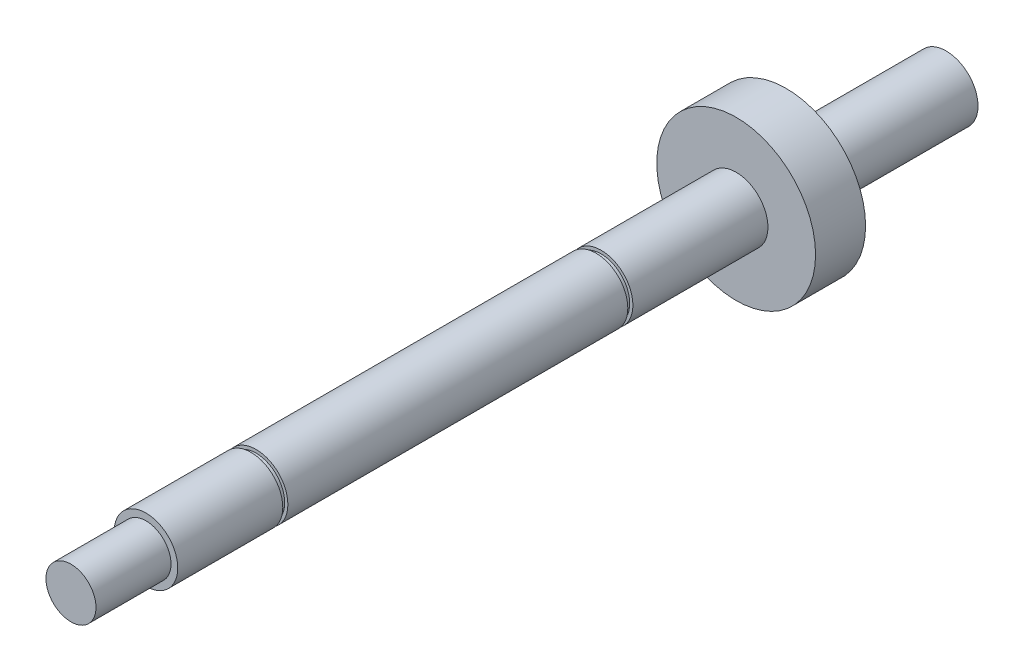
ISO-10303-21;
HEADER;
FILE_DESCRIPTION(('STEP AP214'),'2;1');
FILE_NAME('part.step','',(''),(''),'','','');
FILE_SCHEMA(('AUTOMOTIVE_DESIGN { 1 0 10303 214 1 1 1 1 }'));
ENDSEC;
DATA;
#1=APPLICATION_CONTEXT('core data for automotive mechanical design processes');
#2=APPLICATION_PROTOCOL_DEFINITION('international standard','automotive_design',2000,#1);
#3=PRODUCT_CONTEXT('',#1,'mechanical');
#4=PRODUCT('Part','Part','',(#3));
#5=PRODUCT_RELATED_PRODUCT_CATEGORY('part','',(#4));
#6=PRODUCT_DEFINITION_FORMATION('','',#4);
#7=PRODUCT_DEFINITION_CONTEXT('part definition',#1,'design');
#8=PRODUCT_DEFINITION('design','',#6,#7);
#9=PRODUCT_DEFINITION_SHAPE('','',#8);
#10=(LENGTH_UNIT() NAMED_UNIT(*) SI_UNIT(.MILLI.,.METRE.));
#11=(NAMED_UNIT(*) PLANE_ANGLE_UNIT() SI_UNIT($,.RADIAN.));
#12=(NAMED_UNIT(*) SI_UNIT($,.STERADIAN.) SOLID_ANGLE_UNIT());
#13=UNCERTAINTY_MEASURE_WITH_UNIT(LENGTH_MEASURE(1.E-05),#10,'distance_accuracy_value','');
#14=(GEOMETRIC_REPRESENTATION_CONTEXT(3) GLOBAL_UNCERTAINTY_ASSIGNED_CONTEXT((#13)) GLOBAL_UNIT_ASSIGNED_CONTEXT((#10,
#11,#12)) REPRESENTATION_CONTEXT('',''));
#15=CARTESIAN_POINT('',(0.,0.,0.));
#16=DIRECTION('',(0.,0.,1.));
#17=DIRECTION('',(1.,0.,0.));
#18=AXIS2_PLACEMENT_3D('',#15,#16,#17);
#19=CARTESIAN_POINT('',(0.,0.,175.));
#20=DIRECTION('',(0.,0.,-1.));
#21=DIRECTION('',(-1.,0.,0.));
#22=AXIS2_PLACEMENT_3D('',#19,#20,#21);
#23=CYLINDRICAL_SURFACE('',#22,6.35);
#24=CARTESIAN_POINT('',(0.,0.,70.016));
#25=DIRECTION('',(0.,0.,1.));
#26=DIRECTION('',(1.,0.,0.));
#27=AXIS2_PLACEMENT_3D('',#24,#25,#26);
#28=CIRCLE('',#27,6.35);
#29=CARTESIAN_POINT('',(6.35,0.,70.016));
#30=VERTEX_POINT('',#29);
#31=EDGE_CURVE('E53',#30,#30,#28,.T.);
#32=ORIENTED_EDGE('',*,*,#31,.T.);
#33=EDGE_LOOP('',(#32));
#34=FACE_BOUND('',#33,.T.);
#35=CARTESIAN_POINT('',(0.,0.,137.984));
#36=DIRECTION('',(0.,0.,1.));
#37=DIRECTION('',(1.,0.,0.));
#38=AXIS2_PLACEMENT_3D('',#35,#36,#37);
#39=CIRCLE('',#38,6.35);
#40=CARTESIAN_POINT('',(6.35,0.,137.984));
#41=VERTEX_POINT('',#40);
#42=EDGE_CURVE('E35',#41,#41,#39,.T.);
#43=ORIENTED_EDGE('',*,*,#42,.F.);
#44=EDGE_LOOP('',(#43));
#45=FACE_BOUND('',#44,.T.);
#46=ADVANCED_FACE('F31',(#34,#45),#23,.T.);
#47=CARTESIAN_POINT('',(0.,0.,42.));
#48=DIRECTION('',(0.,0.,1.));
#49=DIRECTION('',(1.,0.,0.));
#50=AXIS2_PLACEMENT_3D('',#47,#48,#49);
#51=CIRCLE('',#50,6.35);
#52=CARTESIAN_POINT('',(6.35,0.,42.));
#53=VERTEX_POINT('',#52);
#54=EDGE_CURVE('E48',#53,#53,#51,.T.);
#55=ORIENTED_EDGE('',*,*,#54,.T.);
#56=EDGE_LOOP('',(#55));
#57=FACE_BOUND('',#56,.T.);
#58=CARTESIAN_POINT('',(0.,0.,69.));
#59=DIRECTION('',(0.,0.,1.));
#60=DIRECTION('',(1.,0.,0.));
#61=AXIS2_PLACEMENT_3D('',#58,#59,#60);
#62=CIRCLE('',#61,6.35);
#63=CARTESIAN_POINT('',(6.35,0.,69.));
#64=VERTEX_POINT('',#63);
#65=EDGE_CURVE('E50',#64,#64,#62,.T.);
#66=ORIENTED_EDGE('',*,*,#65,.F.);
#67=EDGE_LOOP('',(#66));
#68=FACE_BOUND('',#67,.T.);
#69=ADVANCED_FACE('F100',(#57,#68),#23,.T.);
#70=CARTESIAN_POINT('',(0.,0.,32.));
#71=DIRECTION('',(0.,0.,1.));
#72=DIRECTION('',(1.,0.,0.));
#73=AXIS2_PLACEMENT_3D('',#70,#71,#72);
#74=CYLINDRICAL_SURFACE('',#73,15.875);
#75=CARTESIAN_POINT('',(0.,0.,32.));
#76=DIRECTION('',(0.,0.,1.));
#77=DIRECTION('',(1.,0.,0.));
#78=AXIS2_PLACEMENT_3D('',#75,#76,#77);
#79=CIRCLE('',#78,15.875);
#80=CARTESIAN_POINT('',(15.875,0.,32.));
#81=VERTEX_POINT('',#80);
#82=EDGE_CURVE('E76',#81,#81,#79,.T.);
#83=ORIENTED_EDGE('',*,*,#82,.T.);
#84=EDGE_LOOP('',(#83));
#85=FACE_BOUND('',#84,.T.);
#86=CARTESIAN_POINT('',(0.,0.,42.));
#87=DIRECTION('',(0.,0.,1.));
#88=DIRECTION('',(1.,0.,0.));
#89=AXIS2_PLACEMENT_3D('',#86,#87,#88);
#90=CIRCLE('',#89,15.875);
#91=CARTESIAN_POINT('',(15.875,0.,42.));
#92=VERTEX_POINT('',#91);
#93=EDGE_CURVE('E56',#92,#92,#90,.T.);
#94=ORIENTED_EDGE('',*,*,#93,.F.);
#95=EDGE_LOOP('',(#94));
#96=FACE_BOUND('',#95,.T.);
#97=ADVANCED_FACE('F117',(#85,#96),#74,.T.);
#98=CARTESIAN_POINT('',(0.,0.,32.));
#99=DIRECTION('',(0.,0.,1.));
#100=DIRECTION('',(1.,0.,0.));
#101=AXIS2_PLACEMENT_3D('',#98,#99,#100);
#102=PLANE('',#101);
#103=CARTESIAN_POINT('',(0.,0.,32.));
#104=DIRECTION('',(0.,0.,1.));
#105=DIRECTION('',(1.,0.,0.));
#106=AXIS2_PLACEMENT_3D('',#103,#104,#105);
#107=CIRCLE('',#106,6.35);
#108=CARTESIAN_POINT('',(6.35,0.,32.));
#109=VERTEX_POINT('',#108);
#110=EDGE_CURVE('E10',#109,#109,#107,.T.);
#111=ORIENTED_EDGE('',*,*,#110,.T.);
#112=EDGE_LOOP('',(#111));
#113=FACE_BOUND('',#112,.T.);
#114=ORIENTED_EDGE('',*,*,#82,.F.);
#115=EDGE_LOOP('',(#114));
#116=FACE_BOUND('',#115,.T.);
#117=ADVANCED_FACE('F122',(#113,#116),#102,.F.);
#118=CARTESIAN_POINT('',(0.,0.,42.));
#119=DIRECTION('',(0.,0.,1.));
#120=DIRECTION('',(1.,0.,0.));
#121=AXIS2_PLACEMENT_3D('',#118,#119,#120);
#122=PLANE('',#121);
#123=ORIENTED_EDGE('',*,*,#54,.F.);
#124=EDGE_LOOP('',(#123));
#125=FACE_BOUND('',#124,.T.);
#126=ORIENTED_EDGE('',*,*,#93,.T.);
#127=EDGE_LOOP('',(#126));
#128=FACE_BOUND('',#127,.T.);
#129=ADVANCED_FACE('F113',(#125,#128),#122,.T.);
#130=CARTESIAN_POINT('',(0.,0.,0.));
#131=DIRECTION('',(0.,0.,1.));
#132=DIRECTION('',(1.,0.,0.));
#133=AXIS2_PLACEMENT_3D('',#130,#131,#132);
#134=PLANE('',#133);
#135=CARTESIAN_POINT('',(0.,0.,0.));
#136=DIRECTION('',(0.,0.,1.));
#137=DIRECTION('',(1.,0.,0.));
#138=AXIS2_PLACEMENT_3D('',#135,#136,#137);
#139=CIRCLE('',#138,6.35);
#140=CARTESIAN_POINT('',(6.35,0.,0.));
#141=VERTEX_POINT('',#140);
#142=EDGE_CURVE('E39',#141,#141,#139,.T.);
#143=ORIENTED_EDGE('',*,*,#142,.F.);
#144=EDGE_LOOP('',(#143));
#145=FACE_BOUND('',#144,.T.);
#146=ADVANCED_FACE('F104',(#145),#134,.F.);
#147=ORIENTED_EDGE('',*,*,#142,.T.);
#148=EDGE_LOOP('',(#147));
#149=FACE_BOUND('',#148,.T.);
#150=ORIENTED_EDGE('',*,*,#110,.F.);
#151=EDGE_LOOP('',(#150));
#152=FACE_BOUND('',#151,.T.);
#153=ADVANCED_FACE('F92',(#149,#152),#23,.T.);
#154=CARTESIAN_POINT('',(0.,0.,70.016));
#155=DIRECTION('',(0.,0.,1.));
#156=DIRECTION('',(1.,0.,0.));
#157=AXIS2_PLACEMENT_3D('',#154,#155,#156);
#158=PLANE('',#157);
#159=CARTESIAN_POINT('',(0.,0.,70.016));
#160=DIRECTION('',(0.,0.,1.));
#161=DIRECTION('',(1.,0.,0.));
#162=AXIS2_PLACEMENT_3D('',#159,#160,#161);
#163=CIRCLE('',#162,5.715);
#164=CARTESIAN_POINT('',(5.715,0.,70.016));
#165=VERTEX_POINT('',#164);
#166=EDGE_CURVE('E54',#165,#165,#163,.T.);
#167=ORIENTED_EDGE('',*,*,#166,.T.);
#168=EDGE_LOOP('',(#167));
#169=FACE_BOUND('',#168,.T.);
#170=ORIENTED_EDGE('',*,*,#31,.F.);
#171=EDGE_LOOP('',(#170));
#172=FACE_BOUND('',#171,.T.);
#173=ADVANCED_FACE('F103',(#169,#172),#158,.F.);
#174=CARTESIAN_POINT('',(0.,0.,69.));
#175=DIRECTION('',(0.,0.,1.));
#176=DIRECTION('',(1.,0.,0.));
#177=AXIS2_PLACEMENT_3D('',#174,#175,#176);
#178=PLANE('',#177);
#179=CARTESIAN_POINT('',(0.,0.,69.));
#180=DIRECTION('',(0.,0.,1.));
#181=DIRECTION('',(1.,0.,0.));
#182=AXIS2_PLACEMENT_3D('',#179,#180,#181);
#183=CIRCLE('',#182,5.715);
#184=CARTESIAN_POINT('',(5.715,0.,69.));
#185=VERTEX_POINT('',#184);
#186=EDGE_CURVE('E63',#185,#185,#183,.T.);
#187=ORIENTED_EDGE('',*,*,#186,.F.);
#188=EDGE_LOOP('',(#187));
#189=FACE_BOUND('',#188,.T.);
#190=ORIENTED_EDGE('',*,*,#65,.T.);
#191=EDGE_LOOP('',(#190));
#192=FACE_BOUND('',#191,.T.);
#193=ADVANCED_FACE('F110',(#189,#192),#178,.T.);
#194=CARTESIAN_POINT('',(0.,0.,70.016));
#195=DIRECTION('',(0.,0.,-1.));
#196=DIRECTION('',(-1.,0.,0.));
#197=AXIS2_PLACEMENT_3D('',#194,#195,#196);
#198=CYLINDRICAL_SURFACE('',#197,5.715);
#199=ORIENTED_EDGE('',*,*,#166,.F.);
#200=EDGE_LOOP('',(#199));
#201=FACE_BOUND('',#200,.T.);
#202=ORIENTED_EDGE('',*,*,#186,.T.);
#203=EDGE_LOOP('',(#202));
#204=FACE_BOUND('',#203,.T.);
#205=ADVANCED_FACE('F131',(#201,#204),#198,.T.);
#206=CARTESIAN_POINT('',(0.,0.,137.984));
#207=DIRECTION('',(0.,0.,1.));
#208=DIRECTION('',(1.,0.,0.));
#209=AXIS2_PLACEMENT_3D('',#206,#207,#208);
#210=PLANE('',#209);
#211=CARTESIAN_POINT('',(0.,0.,137.984));
#212=DIRECTION('',(0.,0.,1.));
#213=DIRECTION('',(1.,0.,0.));
#214=AXIS2_PLACEMENT_3D('',#211,#212,#213);
#215=CIRCLE('',#214,5.715);
#216=CARTESIAN_POINT('',(5.715,0.,137.984));
#217=VERTEX_POINT('',#216);
#218=EDGE_CURVE('E59',#217,#217,#215,.T.);
#219=ORIENTED_EDGE('',*,*,#218,.F.);
#220=EDGE_LOOP('',(#219));
#221=FACE_BOUND('',#220,.T.);
#222=ORIENTED_EDGE('',*,*,#42,.T.);
#223=EDGE_LOOP('',(#222));
#224=FACE_BOUND('',#223,.T.);
#225=ADVANCED_FACE('F137',(#221,#224),#210,.T.);
#226=CARTESIAN_POINT('',(0.,0.,139.));
#227=DIRECTION('',(0.,0.,1.));
#228=DIRECTION('',(1.,0.,0.));
#229=AXIS2_PLACEMENT_3D('',#226,#227,#228);
#230=PLANE('',#229);
#231=CARTESIAN_POINT('',(0.,0.,139.));
#232=DIRECTION('',(0.,0.,1.));
#233=DIRECTION('',(1.,0.,0.));
#234=AXIS2_PLACEMENT_3D('',#231,#232,#233);
#235=CIRCLE('',#234,5.715);
#236=CARTESIAN_POINT('',(5.715,0.,139.));
#237=VERTEX_POINT('',#236);
#238=EDGE_CURVE('E65',#237,#237,#235,.T.);
#239=ORIENTED_EDGE('',*,*,#238,.T.);
#240=EDGE_LOOP('',(#239));
#241=FACE_BOUND('',#240,.T.);
#242=CARTESIAN_POINT('',(0.,0.,139.));
#243=DIRECTION('',(0.,0.,1.));
#244=DIRECTION('',(1.,0.,0.));
#245=AXIS2_PLACEMENT_3D('',#242,#243,#244);
#246=CIRCLE('',#245,6.35);
#247=CARTESIAN_POINT('',(6.35,0.,139.));
#248=VERTEX_POINT('',#247);
#249=EDGE_CURVE('E57',#248,#248,#246,.T.);
#250=ORIENTED_EDGE('',*,*,#249,.F.);
#251=EDGE_LOOP('',(#250));
#252=FACE_BOUND('',#251,.T.);
#253=ADVANCED_FACE('F157',(#241,#252),#230,.F.);
#254=CARTESIAN_POINT('',(0.,0.,137.984));
#255=DIRECTION('',(0.,0.,1.));
#256=DIRECTION('',(1.,0.,0.));
#257=AXIS2_PLACEMENT_3D('',#254,#255,#256);
#258=CYLINDRICAL_SURFACE('',#257,5.715);
#259=ORIENTED_EDGE('',*,*,#218,.T.);
#260=EDGE_LOOP('',(#259));
#261=FACE_BOUND('',#260,.T.);
#262=ORIENTED_EDGE('',*,*,#238,.F.);
#263=EDGE_LOOP('',(#262));
#264=FACE_BOUND('',#263,.T.);
#265=ADVANCED_FACE('F152',(#261,#264),#258,.T.);
#266=CARTESIAN_POINT('',(0.,0.,175.));
#267=DIRECTION('',(0.,0.,1.));
#268=DIRECTION('',(1.,0.,0.));
#269=AXIS2_PLACEMENT_3D('',#266,#267,#268);
#270=PLANE('',#269);
#271=CARTESIAN_POINT('',(0.,0.,175.));
#272=DIRECTION('',(0.,0.,1.));
#273=DIRECTION('',(1.,0.,0.));
#274=AXIS2_PLACEMENT_3D('',#271,#272,#273);
#275=CIRCLE('',#274,5.);
#276=CARTESIAN_POINT('',(5.,0.,175.));
#277=VERTEX_POINT('',#276);
#278=EDGE_CURVE('E84',#277,#277,#275,.T.);
#279=ORIENTED_EDGE('',*,*,#278,.T.);
#280=EDGE_LOOP('',(#279));
#281=FACE_BOUND('',#280,.T.);
#282=ADVANCED_FACE('F148',(#281),#270,.T.);
#283=CARTESIAN_POINT('',(0.,0.,160.));
#284=DIRECTION('',(0.,0.,1.));
#285=DIRECTION('',(1.,0.,0.));
#286=AXIS2_PLACEMENT_3D('',#283,#284,#285);
#287=CYLINDRICAL_SURFACE('',#286,5.);
#288=CARTESIAN_POINT('',(0.,0.,160.));
#289=DIRECTION('',(0.,0.,1.));
#290=DIRECTION('',(1.,0.,0.));
#291=AXIS2_PLACEMENT_3D('',#288,#289,#290);
#292=CIRCLE('',#291,5.);
#293=CARTESIAN_POINT('',(5.,0.,160.));
#294=VERTEX_POINT('',#293);
#295=EDGE_CURVE('E81',#294,#294,#292,.T.);
#296=ORIENTED_EDGE('',*,*,#295,.T.);
#297=EDGE_LOOP('',(#296));
#298=FACE_BOUND('',#297,.T.);
#299=ORIENTED_EDGE('',*,*,#278,.F.);
#300=EDGE_LOOP('',(#299));
#301=FACE_BOUND('',#300,.T.);
#302=ADVANCED_FACE('F96',(#298,#301),#287,.T.);
#303=CARTESIAN_POINT('',(0.,0.,160.));
#304=DIRECTION('',(0.,0.,1.));
#305=DIRECTION('',(1.,0.,0.));
#306=AXIS2_PLACEMENT_3D('',#303,#304,#305);
#307=PLANE('',#306);
#308=ORIENTED_EDGE('',*,*,#295,.F.);
#309=EDGE_LOOP('',(#308));
#310=FACE_BOUND('',#309,.T.);
#311=CARTESIAN_POINT('',(0.,0.,160.));
#312=DIRECTION('',(0.,0.,1.));
#313=DIRECTION('',(1.,0.,0.));
#314=AXIS2_PLACEMENT_3D('',#311,#312,#313);
#315=CIRCLE('',#314,6.35);
#316=CARTESIAN_POINT('',(6.35,0.,160.));
#317=VERTEX_POINT('',#316);
#318=EDGE_CURVE('E44',#317,#317,#315,.T.);
#319=ORIENTED_EDGE('',*,*,#318,.T.);
#320=EDGE_LOOP('',(#319));
#321=FACE_BOUND('',#320,.T.);
#322=ADVANCED_FACE('F89',(#310,#321),#307,.T.);
#323=ORIENTED_EDGE('',*,*,#249,.T.);
#324=EDGE_LOOP('',(#323));
#325=FACE_BOUND('',#324,.T.);
#326=ORIENTED_EDGE('',*,*,#318,.F.);
#327=EDGE_LOOP('',(#326));
#328=FACE_BOUND('',#327,.T.);
#329=ADVANCED_FACE('F33',(#325,#328),#23,.T.);
#330=CLOSED_SHELL('',(#46,#69,#97,#117,#129,#146,#153,#173,#193,#205,#225,#253,#265,#282,#302,
#322,#329));
#331=MANIFOLD_SOLID_BREP('B2',#330);
#332=ADVANCED_BREP_SHAPE_REPRESENTATION('',(#18,#331),#14);
#333=SHAPE_DEFINITION_REPRESENTATION(#9,#332);
ENDSEC;
END-ISO-10303-21;
